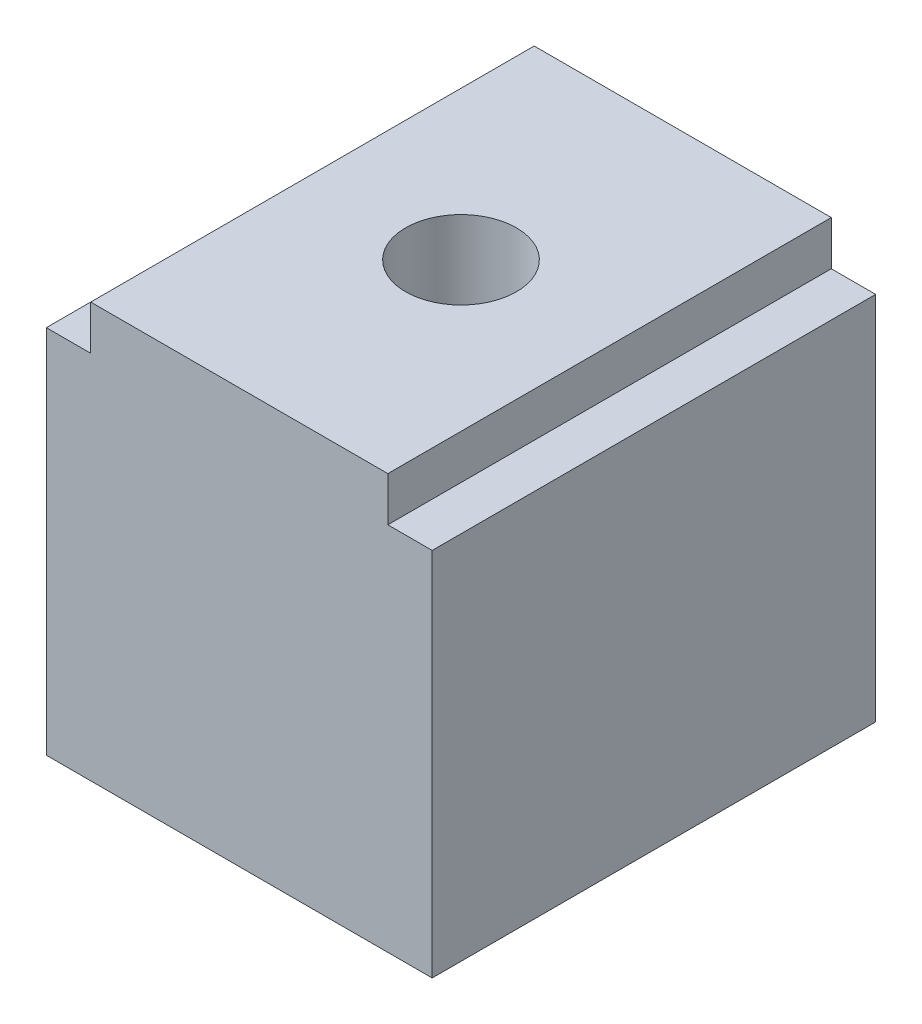
ISO-10303-21;
HEADER;
FILE_DESCRIPTION(('STEP AP214'),'2;1');
FILE_NAME('part.step','',(''),(''),'','','');
FILE_SCHEMA(('AUTOMOTIVE_DESIGN { 1 0 10303 214 1 1 1 1 }'));
ENDSEC;
DATA;
#1=APPLICATION_CONTEXT('core data for automotive mechanical design processes');
#2=APPLICATION_PROTOCOL_DEFINITION('international standard','automotive_design',2000,#1);
#3=PRODUCT_CONTEXT('',#1,'mechanical');
#4=PRODUCT('Part','Part','',(#3));
#5=PRODUCT_RELATED_PRODUCT_CATEGORY('part','',(#4));
#6=PRODUCT_DEFINITION_FORMATION('','',#4);
#7=PRODUCT_DEFINITION_CONTEXT('part definition',#1,'design');
#8=PRODUCT_DEFINITION('design','',#6,#7);
#9=PRODUCT_DEFINITION_SHAPE('','',#8);
#10=(LENGTH_UNIT() NAMED_UNIT(*) SI_UNIT(.MILLI.,.METRE.));
#11=(NAMED_UNIT(*) PLANE_ANGLE_UNIT() SI_UNIT($,.RADIAN.));
#12=(NAMED_UNIT(*) SI_UNIT($,.STERADIAN.) SOLID_ANGLE_UNIT());
#13=UNCERTAINTY_MEASURE_WITH_UNIT(LENGTH_MEASURE(1.E-05),#10,'distance_accuracy_value','');
#14=(GEOMETRIC_REPRESENTATION_CONTEXT(3) GLOBAL_UNCERTAINTY_ASSIGNED_CONTEXT((#13)) GLOBAL_UNIT_ASSIGNED_CONTEXT((#10,
#11,#12)) REPRESENTATION_CONTEXT('',''));
#15=CARTESIAN_POINT('',(0.,0.,0.));
#16=DIRECTION('',(0.,0.,1.));
#17=DIRECTION('',(1.,0.,0.));
#18=AXIS2_PLACEMENT_3D('',#15,#16,#17);
#19=CARTESIAN_POINT('',(0.,23.749,0.));
#20=DIRECTION('',(0.,-1.,0.));
#21=DIRECTION('',(0.,0.,-1.));
#22=AXIS2_PLACEMENT_3D('',#19,#20,#21);
#23=PLANE('',#22);
#24=DIRECTION('',(-1.,0.,0.));
#25=VECTOR('',#24,1.);
#26=CARTESIAN_POINT('',(-11.049,23.749,-12.7));
#27=LINE('',#26,#25);
#28=CARTESIAN_POINT('',(8.509,23.749,-12.7));
#29=VERTEX_POINT('',#28);
#30=CARTESIAN_POINT('',(-8.509,23.749,-12.7));
#31=VERTEX_POINT('',#30);
#32=EDGE_CURVE('E127',#29,#31,#27,.T.);
#33=ORIENTED_EDGE('',*,*,#32,.T.);
#34=DIRECTION('',(0.,0.,-1.));
#35=VECTOR('',#34,1.);
#36=CARTESIAN_POINT('',(-8.509,23.749,-12.7));
#37=LINE('',#36,#35);
#38=CARTESIAN_POINT('',(-8.50899999999999,23.749,12.7));
#39=VERTEX_POINT('',#38);
#40=EDGE_CURVE('E105',#39,#31,#37,.T.);
#41=ORIENTED_EDGE('',*,*,#40,.F.);
#42=DIRECTION('',(1.,0.,0.));
#43=VECTOR('',#42,1.);
#44=CARTESIAN_POINT('',(-11.049,23.749,12.7));
#45=LINE('',#44,#43);
#46=CARTESIAN_POINT('',(8.509,23.749,12.7));
#47=VERTEX_POINT('',#46);
#48=EDGE_CURVE('E123',#39,#47,#45,.T.);
#49=ORIENTED_EDGE('',*,*,#48,.T.);
#50=DIRECTION('',(0.,0.,1.));
#51=VECTOR('',#50,1.);
#52=CARTESIAN_POINT('',(8.509,23.749,-12.7));
#53=LINE('',#52,#51);
#54=EDGE_CURVE('E149',#29,#47,#53,.T.);
#55=ORIENTED_EDGE('',*,*,#54,.F.);
#56=EDGE_LOOP('',(#33,#41,#49,#55));
#57=FACE_BOUND('',#56,.T.);
#58=CARTESIAN_POINT('',(0.,23.749,0.));
#59=DIRECTION('',(0.,1.,0.));
#60=DIRECTION('',(0.,0.,1.));
#61=AXIS2_PLACEMENT_3D('',#58,#59,#60);
#62=CIRCLE('',#61,3.175);
#63=CARTESIAN_POINT('',(0.,23.749,-3.175));
#64=VERTEX_POINT('',#63);
#65=EDGE_CURVE('E134',#64,#64,#62,.T.);
#66=ORIENTED_EDGE('',*,*,#65,.F.);
#67=EDGE_LOOP('',(#66));
#68=FACE_BOUND('',#67,.T.);
#69=ADVANCED_FACE('F35',(#57,#68),#23,.F.);
#70=CARTESIAN_POINT('',(0.,0.,0.));
#71=DIRECTION('',(0.,-1.,0.));
#72=DIRECTION('',(0.,0.,-1.));
#73=AXIS2_PLACEMENT_3D('',#70,#71,#72);
#74=PLANE('',#73);
#75=DIRECTION('',(0.,0.,-1.));
#76=VECTOR('',#75,1.);
#77=CARTESIAN_POINT('',(11.049,0.,12.7));
#78=LINE('',#77,#76);
#79=CARTESIAN_POINT('',(11.049,0.,12.7));
#80=VERTEX_POINT('',#79);
#81=CARTESIAN_POINT('',(11.049,0.,-12.7));
#82=VERTEX_POINT('',#81);
#83=EDGE_CURVE('E131',#80,#82,#78,.T.);
#84=ORIENTED_EDGE('',*,*,#83,.F.);
#85=DIRECTION('',(1.,0.,0.));
#86=VECTOR('',#85,1.);
#87=CARTESIAN_POINT('',(-11.049,0.,12.7));
#88=LINE('',#87,#86);
#89=CARTESIAN_POINT('',(-11.049,0.,12.7));
#90=VERTEX_POINT('',#89);
#91=EDGE_CURVE('E124',#90,#80,#88,.T.);
#92=ORIENTED_EDGE('',*,*,#91,.F.);
#93=DIRECTION('',(0.,0.,1.));
#94=VECTOR('',#93,1.);
#95=CARTESIAN_POINT('',(-11.049,0.,12.7));
#96=LINE('',#95,#94);
#97=CARTESIAN_POINT('',(-11.049,0.,-12.7));
#98=VERTEX_POINT('',#97);
#99=EDGE_CURVE('E128',#98,#90,#96,.T.);
#100=ORIENTED_EDGE('',*,*,#99,.F.);
#101=DIRECTION('',(-1.,0.,0.));
#102=VECTOR('',#101,1.);
#103=CARTESIAN_POINT('',(-11.049,0.,-12.7));
#104=LINE('',#103,#102);
#105=EDGE_CURVE('E117',#82,#98,#104,.T.);
#106=ORIENTED_EDGE('',*,*,#105,.F.);
#107=EDGE_LOOP('',(#84,#92,#100,#106));
#108=FACE_BOUND('',#107,.T.);
#109=CARTESIAN_POINT('',(0.,0.,0.));
#110=DIRECTION('',(0.,1.,0.));
#111=DIRECTION('',(0.,0.,1.));
#112=AXIS2_PLACEMENT_3D('',#109,#110,#111);
#113=CIRCLE('',#112,3.175);
#114=CARTESIAN_POINT('',(0.,0.,-3.175));
#115=VERTEX_POINT('',#114);
#116=EDGE_CURVE('E138',#115,#115,#113,.T.);
#117=ORIENTED_EDGE('',*,*,#116,.T.);
#118=EDGE_LOOP('',(#117));
#119=FACE_BOUND('',#118,.T.);
#120=ADVANCED_FACE('F187',(#108,#119),#74,.T.);
#121=CARTESIAN_POINT('',(11.049,23.749,12.7));
#122=DIRECTION('',(-1.,0.,0.));
#123=DIRECTION('',(0.,0.,1.));
#124=AXIS2_PLACEMENT_3D('',#121,#122,#123);
#125=PLANE('',#124);
#126=DIRECTION('',(0.,-1.,0.));
#127=VECTOR('',#126,1.);
#128=CARTESIAN_POINT('',(11.049,23.749,-12.7));
#129=LINE('',#128,#127);
#130=CARTESIAN_POINT('',(11.049,21.209,-12.7));
#131=VERTEX_POINT('',#130);
#132=EDGE_CURVE('E11',#131,#82,#129,.T.);
#133=ORIENTED_EDGE('',*,*,#132,.F.);
#134=DIRECTION('',(0.,0.,-1.));
#135=VECTOR('',#134,1.);
#136=CARTESIAN_POINT('',(11.049,21.209,-12.7));
#137=LINE('',#136,#135);
#138=CARTESIAN_POINT('',(11.049,21.209,12.7));
#139=VERTEX_POINT('',#138);
#140=EDGE_CURVE('E152',#139,#131,#137,.T.);
#141=ORIENTED_EDGE('',*,*,#140,.F.);
#142=DIRECTION('',(0.,-1.,0.));
#143=VECTOR('',#142,1.);
#144=CARTESIAN_POINT('',(11.049,23.749,12.7));
#145=LINE('',#144,#143);
#146=EDGE_CURVE('E119',#139,#80,#145,.T.);
#147=ORIENTED_EDGE('',*,*,#146,.T.);
#148=ORIENTED_EDGE('',*,*,#83,.T.);
#149=EDGE_LOOP('',(#133,#141,#147,#148));
#150=FACE_BOUND('',#149,.T.);
#151=ADVANCED_FACE('F37',(#150),#125,.F.);
#152=CARTESIAN_POINT('',(-11.049,23.749,-12.7));
#153=DIRECTION('',(0.,0.,1.));
#154=DIRECTION('',(1.,0.,0.));
#155=AXIS2_PLACEMENT_3D('',#152,#153,#154);
#156=PLANE('',#155);
#157=DIRECTION('',(-1.,0.,0.));
#158=VECTOR('',#157,1.);
#159=CARTESIAN_POINT('',(-11.049,21.209,-12.7));
#160=LINE('',#159,#158);
#161=CARTESIAN_POINT('',(-8.509,21.209,-12.7));
#162=VERTEX_POINT('',#161);
#163=CARTESIAN_POINT('',(-11.049,21.209,-12.7));
#164=VERTEX_POINT('',#163);
#165=EDGE_CURVE('E98',#162,#164,#160,.T.);
#166=ORIENTED_EDGE('',*,*,#165,.F.);
#167=DIRECTION('',(0.,1.,0.));
#168=VECTOR('',#167,1.);
#169=CARTESIAN_POINT('',(-8.509,21.209,-12.7));
#170=LINE('',#169,#168);
#171=EDGE_CURVE('E153',#162,#31,#170,.T.);
#172=ORIENTED_EDGE('',*,*,#171,.T.);
#173=ORIENTED_EDGE('',*,*,#32,.F.);
#174=DIRECTION('',(0.,1.,0.));
#175=VECTOR('',#174,1.);
#176=CARTESIAN_POINT('',(8.509,21.209,-12.7));
#177=LINE('',#176,#175);
#178=CARTESIAN_POINT('',(8.509,21.209,-12.7));
#179=VERTEX_POINT('',#178);
#180=EDGE_CURVE('E144',#179,#29,#177,.T.);
#181=ORIENTED_EDGE('',*,*,#180,.F.);
#182=DIRECTION('',(-1.,0.,0.));
#183=VECTOR('',#182,1.);
#184=CARTESIAN_POINT('',(11.049,21.209,-12.7));
#185=LINE('',#184,#183);
#186=EDGE_CURVE('E156',#131,#179,#185,.T.);
#187=ORIENTED_EDGE('',*,*,#186,.F.);
#188=ORIENTED_EDGE('',*,*,#132,.T.);
#189=ORIENTED_EDGE('',*,*,#105,.T.);
#190=DIRECTION('',(0.,-1.,0.));
#191=VECTOR('',#190,1.);
#192=CARTESIAN_POINT('',(-11.049,23.749,-12.7));
#193=LINE('',#192,#191);
#194=EDGE_CURVE('E43',#164,#98,#193,.T.);
#195=ORIENTED_EDGE('',*,*,#194,.F.);
#196=EDGE_LOOP('',(#166,#172,#173,#181,#187,#188,#189,#195));
#197=FACE_BOUND('',#196,.T.);
#198=ADVANCED_FACE('F115',(#197),#156,.F.);
#199=CARTESIAN_POINT('',(-11.049,23.749,12.7));
#200=DIRECTION('',(1.,0.,0.));
#201=DIRECTION('',(0.,0.,-1.));
#202=AXIS2_PLACEMENT_3D('',#199,#200,#201);
#203=PLANE('',#202);
#204=DIRECTION('',(0.,-1.,0.));
#205=VECTOR('',#204,1.);
#206=CARTESIAN_POINT('',(-11.049,23.749,12.7));
#207=LINE('',#206,#205);
#208=CARTESIAN_POINT('',(-11.049,21.209,12.7));
#209=VERTEX_POINT('',#208);
#210=EDGE_CURVE('E112',#209,#90,#207,.T.);
#211=ORIENTED_EDGE('',*,*,#210,.F.);
#212=DIRECTION('',(0.,0.,1.));
#213=VECTOR('',#212,1.);
#214=CARTESIAN_POINT('',(-11.049,21.209,-12.7));
#215=LINE('',#214,#213);
#216=EDGE_CURVE('E50',#164,#209,#215,.T.);
#217=ORIENTED_EDGE('',*,*,#216,.F.);
#218=ORIENTED_EDGE('',*,*,#194,.T.);
#219=ORIENTED_EDGE('',*,*,#99,.T.);
#220=EDGE_LOOP('',(#211,#217,#218,#219));
#221=FACE_BOUND('',#220,.T.);
#222=ADVANCED_FACE('F109',(#221),#203,.F.);
#223=CARTESIAN_POINT('',(-11.049,23.749,12.7));
#224=DIRECTION('',(0.,0.,-1.));
#225=DIRECTION('',(-1.,0.,0.));
#226=AXIS2_PLACEMENT_3D('',#223,#224,#225);
#227=PLANE('',#226);
#228=ORIENTED_EDGE('',*,*,#48,.F.);
#229=DIRECTION('',(0.,1.,0.));
#230=VECTOR('',#229,1.);
#231=CARTESIAN_POINT('',(-8.50899999999999,21.209,12.7));
#232=LINE('',#231,#230);
#233=CARTESIAN_POINT('',(-8.50899999999999,21.209,12.7));
#234=VERTEX_POINT('',#233);
#235=EDGE_CURVE('E159',#234,#39,#232,.T.);
#236=ORIENTED_EDGE('',*,*,#235,.F.);
#237=DIRECTION('',(1.,0.,0.));
#238=VECTOR('',#237,1.);
#239=CARTESIAN_POINT('',(-11.049,21.209,12.7));
#240=LINE('',#239,#238);
#241=EDGE_CURVE('E113',#209,#234,#240,.T.);
#242=ORIENTED_EDGE('',*,*,#241,.F.);
#243=ORIENTED_EDGE('',*,*,#210,.T.);
#244=ORIENTED_EDGE('',*,*,#91,.T.);
#245=ORIENTED_EDGE('',*,*,#146,.F.);
#246=DIRECTION('',(1.,0.,0.));
#247=VECTOR('',#246,1.);
#248=CARTESIAN_POINT('',(11.049,21.209,12.7));
#249=LINE('',#248,#247);
#250=CARTESIAN_POINT('',(8.509,21.209,12.7));
#251=VERTEX_POINT('',#250);
#252=EDGE_CURVE('E146',#251,#139,#249,.T.);
#253=ORIENTED_EDGE('',*,*,#252,.F.);
#254=DIRECTION('',(0.,1.,0.));
#255=VECTOR('',#254,1.);
#256=CARTESIAN_POINT('',(8.509,21.209,12.7));
#257=LINE('',#256,#255);
#258=EDGE_CURVE('E141',#251,#47,#257,.T.);
#259=ORIENTED_EDGE('',*,*,#258,.T.);
#260=EDGE_LOOP('',(#228,#236,#242,#243,#244,#245,#253,#259));
#261=FACE_BOUND('',#260,.T.);
#262=ADVANCED_FACE('F170',(#261),#227,.F.);
#263=CARTESIAN_POINT('',(0.,23.749,0.));
#264=DIRECTION('',(0.,-1.,0.));
#265=DIRECTION('',(0.,0.,-1.));
#266=AXIS2_PLACEMENT_3D('',#263,#264,#265);
#267=CYLINDRICAL_SURFACE('',#266,3.175);
#268=CARTESIAN_POINT('',(0.,23.749,-3.175));
#269=CARTESIAN_POINT('',(0.,23.5016145833333,-3.175));
#270=CARTESIAN_POINT('',(0.,23.2542291666667,-3.175));
#271=CARTESIAN_POINT('',(0.,22.7594583333333,-3.175));
#272=CARTESIAN_POINT('',(0.,22.5120729166667,-3.175));
#273=CARTESIAN_POINT('',(0.,22.0173020833333,-3.175));
#274=CARTESIAN_POINT('',(0.,21.7699166666667,-3.175));
#275=CARTESIAN_POINT('',(0.,21.2751458333333,-3.175));
#276=CARTESIAN_POINT('',(0.,21.0277604166667,-3.175));
#277=CARTESIAN_POINT('',(0.,20.5329895833333,-3.175));
#278=CARTESIAN_POINT('',(0.,20.2856041666667,-3.175));
#279=CARTESIAN_POINT('',(0.,19.7908333333333,-3.175));
#280=CARTESIAN_POINT('',(0.,19.5434479166667,-3.175));
#281=CARTESIAN_POINT('',(0.,19.0486770833333,-3.175));
#282=CARTESIAN_POINT('',(0.,18.8012916666667,-3.175));
#283=CARTESIAN_POINT('',(0.,18.3065208333333,-3.175));
#284=CARTESIAN_POINT('',(0.,18.0591354166667,-3.175));
#285=CARTESIAN_POINT('',(0.,17.5643645833333,-3.175));
#286=CARTESIAN_POINT('',(0.,17.3169791666667,-3.175));
#287=CARTESIAN_POINT('',(0.,16.8222083333333,-3.175));
#288=CARTESIAN_POINT('',(0.,16.5748229166667,-3.175));
#289=CARTESIAN_POINT('',(0.,16.0800520833333,-3.175));
#290=CARTESIAN_POINT('',(0.,15.8326666666667,-3.175));
#291=CARTESIAN_POINT('',(0.,15.3378958333333,-3.175));
#292=CARTESIAN_POINT('',(0.,15.0905104166667,-3.175));
#293=CARTESIAN_POINT('',(0.,14.5957395833333,-3.175));
#294=CARTESIAN_POINT('',(0.,14.3483541666667,-3.175));
#295=CARTESIAN_POINT('',(0.,13.8535833333333,-3.175));
#296=CARTESIAN_POINT('',(0.,13.6061979166667,-3.175));
#297=CARTESIAN_POINT('',(0.,13.1114270833333,-3.175));
#298=CARTESIAN_POINT('',(0.,12.8640416666667,-3.175));
#299=CARTESIAN_POINT('',(0.,12.3692708333333,-3.175));
#300=CARTESIAN_POINT('',(0.,12.1218854166667,-3.175));
#301=CARTESIAN_POINT('',(0.,11.6271145833333,-3.175));
#302=CARTESIAN_POINT('',(0.,11.3797291666667,-3.175));
#303=CARTESIAN_POINT('',(0.,10.8849583333333,-3.175));
#304=CARTESIAN_POINT('',(0.,10.6375729166667,-3.175));
#305=CARTESIAN_POINT('',(0.,10.1428020833333,-3.175));
#306=CARTESIAN_POINT('',(0.,9.89541666666667,-3.175));
#307=CARTESIAN_POINT('',(0.,9.40064583333333,-3.175));
#308=CARTESIAN_POINT('',(0.,9.15326041666667,-3.175));
#309=CARTESIAN_POINT('',(0.,8.65848958333333,-3.175));
#310=CARTESIAN_POINT('',(0.,8.41110416666666,-3.175));
#311=CARTESIAN_POINT('',(0.,7.91633333333333,-3.175));
#312=CARTESIAN_POINT('',(0.,7.66894791666666,-3.175));
#313=CARTESIAN_POINT('',(0.,7.17417708333333,-3.175));
#314=CARTESIAN_POINT('',(0.,6.92679166666666,-3.175));
#315=CARTESIAN_POINT('',(0.,6.43202083333333,-3.175));
#316=CARTESIAN_POINT('',(0.,6.18463541666666,-3.175));
#317=CARTESIAN_POINT('',(0.,5.68986458333333,-3.175));
#318=CARTESIAN_POINT('',(0.,5.44247916666666,-3.175));
#319=CARTESIAN_POINT('',(0.,4.94770833333333,-3.175));
#320=CARTESIAN_POINT('',(0.,4.70032291666666,-3.175));
#321=CARTESIAN_POINT('',(0.,4.20555208333333,-3.175));
#322=CARTESIAN_POINT('',(0.,3.95816666666666,-3.175));
#323=CARTESIAN_POINT('',(0.,3.46339583333333,-3.175));
#324=CARTESIAN_POINT('',(0.,3.21601041666666,-3.175));
#325=CARTESIAN_POINT('',(0.,2.72123958333333,-3.175));
#326=CARTESIAN_POINT('',(0.,2.47385416666666,-3.175));
#327=CARTESIAN_POINT('',(0.,1.97908333333333,-3.175));
#328=CARTESIAN_POINT('',(0.,1.73169791666666,-3.175));
#329=CARTESIAN_POINT('',(0.,1.23692708333333,-3.175));
#330=CARTESIAN_POINT('',(0.,0.989541666666664,-3.175));
#331=CARTESIAN_POINT('',(0.,0.49477083333333,-3.175));
#332=CARTESIAN_POINT('',(0.,0.247385416666663,-3.175));
#333=CARTESIAN_POINT('',(0.,0.,-3.175));
#334=B_SPLINE_CURVE_WITH_KNOTS('',3,(#268,#269,#270,#271,#272,#273,#274,#275,#276,#277,#278,
#279,#280,#281,#282,#283,#284,#285,#286,#287,#288,#289,#290,#291,#292,#293,#294,#295,#296,#297,
#298,#299,#300,#301,#302,#303,#304,#305,#306,#307,#308,#309,#310,#311,#312,#313,#314,#315,#316,
#317,#318,#319,#320,#321,#322,#323,#324,#325,#326,#327,#328,#329,#330,#331,#332,#333),
.UNSPECIFIED.,.F.,.F.,(4,2,2,2,2,2,2,2,2,2,2,2,2,2,2,2,2,2,2,2,2,2,2,2,2,2,2,2,2,2,2,2,4),(0.,
0.742156249999997,1.4843125,2.22646875,2.968625,3.71078125,4.4529375,5.19509375,5.93725,
6.67940625,7.4215625,8.16371875,8.905875,9.64803125,10.3901875,11.13234375,11.8745,12.61665625,
13.3588125,14.10096875,14.843125,15.58528125,16.3274375,17.06959375,17.81175,18.55390625,
19.2960625,20.03821875,20.780375,21.52253125,22.2646875,23.00684375,23.749),.UNSPECIFIED.);
#335=EDGE_CURVE('BSEAM197',#64,#115,#334,.T.);
#336=ORIENTED_EDGE('',*,*,#65,.T.);
#337=ORIENTED_EDGE('',*,*,#116,.F.);
#338=ORIENTED_EDGE('',*,*,#335,.T.);
#339=ORIENTED_EDGE('',*,*,#335,.F.);
#340=EDGE_LOOP('',(#336,#338,#337,#339));
#341=FACE_BOUND('',#340,.T.);
#342=ADVANCED_FACE('F197',(#341),#267,.F.);
#343=CARTESIAN_POINT('',(8.509,21.209,-12.7));
#344=DIRECTION('',(-1.,0.,0.));
#345=DIRECTION('',(0.,0.,1.));
#346=AXIS2_PLACEMENT_3D('',#343,#344,#345);
#347=PLANE('',#346);
#348=ORIENTED_EDGE('',*,*,#54,.T.);
#349=ORIENTED_EDGE('',*,*,#258,.F.);
#350=DIRECTION('',(0.,0.,1.));
#351=VECTOR('',#350,1.);
#352=CARTESIAN_POINT('',(8.509,21.209,-12.7));
#353=LINE('',#352,#351);
#354=EDGE_CURVE('E58',#179,#251,#353,.T.);
#355=ORIENTED_EDGE('',*,*,#354,.F.);
#356=ORIENTED_EDGE('',*,*,#180,.T.);
#357=EDGE_LOOP('',(#348,#349,#355,#356));
#358=FACE_BOUND('',#357,.T.);
#359=ADVANCED_FACE('F177',(#358),#347,.F.);
#360=CARTESIAN_POINT('',(0.,21.209,0.));
#361=DIRECTION('',(0.,-1.,0.));
#362=DIRECTION('',(0.,0.,-1.));
#363=AXIS2_PLACEMENT_3D('',#360,#361,#362);
#364=PLANE('',#363);
#365=ORIENTED_EDGE('',*,*,#140,.T.);
#366=ORIENTED_EDGE('',*,*,#186,.T.);
#367=ORIENTED_EDGE('',*,*,#354,.T.);
#368=ORIENTED_EDGE('',*,*,#252,.T.);
#369=EDGE_LOOP('',(#365,#366,#367,#368));
#370=FACE_BOUND('',#369,.T.);
#371=ADVANCED_FACE('F189',(#370),#364,.F.);
#372=CARTESIAN_POINT('',(-8.509,21.209,-12.7));
#373=DIRECTION('',(1.,0.,0.));
#374=DIRECTION('',(0.,0.,-1.));
#375=AXIS2_PLACEMENT_3D('',#372,#373,#374);
#376=PLANE('',#375);
#377=ORIENTED_EDGE('',*,*,#40,.T.);
#378=ORIENTED_EDGE('',*,*,#171,.F.);
#379=DIRECTION('',(0.,0.,-1.));
#380=VECTOR('',#379,1.);
#381=CARTESIAN_POINT('',(-8.509,21.209,-12.7));
#382=LINE('',#381,#380);
#383=EDGE_CURVE('E101',#234,#162,#382,.T.);
#384=ORIENTED_EDGE('',*,*,#383,.F.);
#385=ORIENTED_EDGE('',*,*,#235,.T.);
#386=EDGE_LOOP('',(#377,#378,#384,#385));
#387=FACE_BOUND('',#386,.T.);
#388=ADVANCED_FACE('F167',(#387),#376,.F.);
#389=CARTESIAN_POINT('',(0.,21.209,0.));
#390=DIRECTION('',(0.,-1.,0.));
#391=DIRECTION('',(0.,0.,-1.));
#392=AXIS2_PLACEMENT_3D('',#389,#390,#391);
#393=PLANE('',#392);
#394=ORIENTED_EDGE('',*,*,#165,.T.);
#395=ORIENTED_EDGE('',*,*,#216,.T.);
#396=ORIENTED_EDGE('',*,*,#241,.T.);
#397=ORIENTED_EDGE('',*,*,#383,.T.);
#398=EDGE_LOOP('',(#394,#395,#396,#397));
#399=FACE_BOUND('',#398,.T.);
#400=ADVANCED_FACE('F99',(#399),#393,.F.);
#401=CLOSED_SHELL('',(#69,#120,#151,#198,#222,#262,#342,#359,#371,#388,#400));
#402=MANIFOLD_SOLID_BREP('B2',#401);
#403=ADVANCED_BREP_SHAPE_REPRESENTATION('',(#18,#402),#14);
#404=SHAPE_DEFINITION_REPRESENTATION(#9,#403);
ENDSEC;
END-ISO-10303-21;
